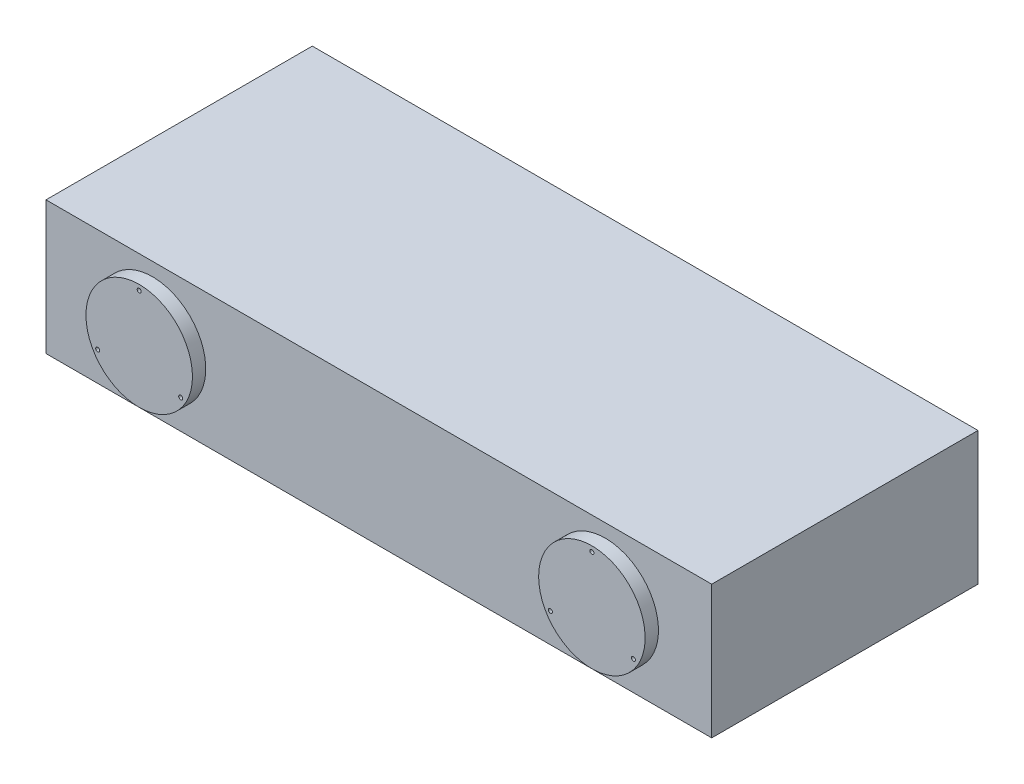
ISO-10303-21;
HEADER;
FILE_DESCRIPTION(('STEP AP214'),'2;1');
FILE_NAME('part.step','',(''),(''),'','','');
FILE_SCHEMA(('AUTOMOTIVE_DESIGN { 1 0 10303 214 1 1 1 1 }'));
ENDSEC;
DATA;
#1=APPLICATION_CONTEXT('core data for automotive mechanical design processes');
#2=APPLICATION_PROTOCOL_DEFINITION('international standard','automotive_design',2000,#1);
#3=PRODUCT_CONTEXT('',#1,'mechanical');
#4=PRODUCT('Part','Part','',(#3));
#5=PRODUCT_RELATED_PRODUCT_CATEGORY('part','',(#4));
#6=PRODUCT_DEFINITION_FORMATION('','',#4);
#7=PRODUCT_DEFINITION_CONTEXT('part definition',#1,'design');
#8=PRODUCT_DEFINITION('design','',#6,#7);
#9=PRODUCT_DEFINITION_SHAPE('','',#8);
#10=(LENGTH_UNIT() NAMED_UNIT(*) SI_UNIT(.MILLI.,.METRE.));
#11=(NAMED_UNIT(*) PLANE_ANGLE_UNIT() SI_UNIT($,.RADIAN.));
#12=(NAMED_UNIT(*) SI_UNIT($,.STERADIAN.) SOLID_ANGLE_UNIT());
#13=UNCERTAINTY_MEASURE_WITH_UNIT(LENGTH_MEASURE(1.E-05),#10,'distance_accuracy_value','');
#14=(GEOMETRIC_REPRESENTATION_CONTEXT(3) GLOBAL_UNCERTAINTY_ASSIGNED_CONTEXT((#13)) GLOBAL_UNIT_ASSIGNED_CONTEXT((#10,
#11,#12)) REPRESENTATION_CONTEXT('',''));
#15=CARTESIAN_POINT('',(0.,0.,0.));
#16=DIRECTION('',(0.,0.,1.));
#17=DIRECTION('',(1.,0.,0.));
#18=AXIS2_PLACEMENT_3D('',#15,#16,#17);
#19=CARTESIAN_POINT('',(-250.,100.,100.));
#20=DIRECTION('',(1.,0.,0.));
#21=DIRECTION('',(0.,0.,-1.));
#22=AXIS2_PLACEMENT_3D('',#19,#20,#21);
#23=PLANE('',#22);
#24=DIRECTION('',(0.,0.,1.));
#25=VECTOR('',#24,1.);
#26=CARTESIAN_POINT('',(-250.,0.,100.));
#27=LINE('',#26,#25);
#28=CARTESIAN_POINT('',(-250.,0.,-100.));
#29=VERTEX_POINT('',#28);
#30=CARTESIAN_POINT('',(-250.,0.,100.));
#31=VERTEX_POINT('',#30);
#32=EDGE_CURVE('E104',#29,#31,#27,.T.);
#33=ORIENTED_EDGE('',*,*,#32,.T.);
#34=DIRECTION('',(0.,-1.,0.));
#35=VECTOR('',#34,1.);
#36=CARTESIAN_POINT('',(-250.,100.,100.));
#37=LINE('',#36,#35);
#38=CARTESIAN_POINT('',(-250.,100.,100.));
#39=VERTEX_POINT('',#38);
#40=EDGE_CURVE('E95',#39,#31,#37,.T.);
#41=ORIENTED_EDGE('',*,*,#40,.F.);
#42=DIRECTION('',(0.,0.,1.));
#43=VECTOR('',#42,1.);
#44=CARTESIAN_POINT('',(-250.,100.,100.));
#45=LINE('',#44,#43);
#46=CARTESIAN_POINT('',(-250.,100.,-100.));
#47=VERTEX_POINT('',#46);
#48=EDGE_CURVE('E89',#47,#39,#45,.T.);
#49=ORIENTED_EDGE('',*,*,#48,.F.);
#50=DIRECTION('',(0.,-1.,0.));
#51=VECTOR('',#50,1.);
#52=CARTESIAN_POINT('',(-250.,100.,-100.));
#53=LINE('',#52,#51);
#54=EDGE_CURVE('E100',#47,#29,#53,.T.);
#55=ORIENTED_EDGE('',*,*,#54,.T.);
#56=EDGE_LOOP('',(#33,#41,#49,#55));
#57=FACE_BOUND('',#56,.T.);
#58=ADVANCED_FACE('F37',(#57),#23,.F.);
#59=CARTESIAN_POINT('',(250.,100.,100.));
#60=DIRECTION('',(0.,0.,-1.));
#61=DIRECTION('',(-1.,0.,0.));
#62=AXIS2_PLACEMENT_3D('',#59,#60,#61);
#63=PLANE('',#62);
#64=CARTESIAN_POINT('',(170.,50.,100.));
#65=DIRECTION('',(0.,0.,-1.));
#66=DIRECTION('',(-1.,0.,0.));
#67=AXIS2_PLACEMENT_3D('',#64,#65,#66);
#68=CIRCLE('',#67,40.);
#69=CARTESIAN_POINT('',(130.,50.,100.));
#70=VERTEX_POINT('',#69);
#71=EDGE_CURVE('E329',#70,#70,#68,.T.);
#72=ORIENTED_EDGE('',*,*,#71,.T.);
#73=EDGE_LOOP('',(#72));
#74=FACE_BOUND('',#73,.T.);
#75=CARTESIAN_POINT('',(-170.,50.,100.));
#76=DIRECTION('',(0.,0.,-1.));
#77=DIRECTION('',(-1.,0.,0.));
#78=AXIS2_PLACEMENT_3D('',#75,#76,#77);
#79=CIRCLE('',#78,40.);
#80=CARTESIAN_POINT('',(-210.,50.,100.));
#81=VERTEX_POINT('',#80);
#82=EDGE_CURVE('E45',#81,#81,#79,.F.);
#83=ORIENTED_EDGE('',*,*,#82,.F.);
#84=EDGE_LOOP('',(#83));
#85=FACE_BOUND('',#84,.T.);
#86=DIRECTION('',(1.,0.,0.));
#87=VECTOR('',#86,1.);
#88=CARTESIAN_POINT('',(250.,0.,100.));
#89=LINE('',#88,#87);
#90=CARTESIAN_POINT('',(250.,0.,100.));
#91=VERTEX_POINT('',#90);
#92=EDGE_CURVE('E94',#31,#91,#89,.T.);
#93=ORIENTED_EDGE('',*,*,#92,.T.);
#94=DIRECTION('',(0.,-1.,0.));
#95=VECTOR('',#94,1.);
#96=CARTESIAN_POINT('',(250.,100.,100.));
#97=LINE('',#96,#95);
#98=CARTESIAN_POINT('',(250.,100.,100.));
#99=VERTEX_POINT('',#98);
#100=EDGE_CURVE('E92',#99,#91,#97,.T.);
#101=ORIENTED_EDGE('',*,*,#100,.F.);
#102=DIRECTION('',(1.,0.,0.));
#103=VECTOR('',#102,1.);
#104=CARTESIAN_POINT('',(250.,100.,100.));
#105=LINE('',#104,#103);
#106=EDGE_CURVE('E84',#39,#99,#105,.T.);
#107=ORIENTED_EDGE('',*,*,#106,.F.);
#108=ORIENTED_EDGE('',*,*,#40,.T.);
#109=EDGE_LOOP('',(#93,#101,#107,#108));
#110=FACE_BOUND('',#109,.T.);
#111=ADVANCED_FACE('F93',(#74,#85,#110),#63,.F.);
#112=CARTESIAN_POINT('',(250.,100.,100.));
#113=DIRECTION('',(-1.,0.,0.));
#114=DIRECTION('',(0.,0.,1.));
#115=AXIS2_PLACEMENT_3D('',#112,#113,#114);
#116=PLANE('',#115);
#117=DIRECTION('',(0.,0.,-1.));
#118=VECTOR('',#117,1.);
#119=CARTESIAN_POINT('',(250.,0.,100.));
#120=LINE('',#119,#118);
#121=CARTESIAN_POINT('',(250.,0.,-100.));
#122=VERTEX_POINT('',#121);
#123=EDGE_CURVE('E70',#91,#122,#120,.T.);
#124=ORIENTED_EDGE('',*,*,#123,.T.);
#125=DIRECTION('',(0.,-1.,0.));
#126=VECTOR('',#125,1.);
#127=CARTESIAN_POINT('',(250.,100.,-100.));
#128=LINE('',#127,#126);
#129=CARTESIAN_POINT('',(250.,100.,-100.));
#130=VERTEX_POINT('',#129);
#131=EDGE_CURVE('E96',#130,#122,#128,.T.);
#132=ORIENTED_EDGE('',*,*,#131,.F.);
#133=DIRECTION('',(0.,0.,-1.));
#134=VECTOR('',#133,1.);
#135=CARTESIAN_POINT('',(250.,100.,100.));
#136=LINE('',#135,#134);
#137=EDGE_CURVE('E87',#99,#130,#136,.T.);
#138=ORIENTED_EDGE('',*,*,#137,.F.);
#139=ORIENTED_EDGE('',*,*,#100,.T.);
#140=EDGE_LOOP('',(#124,#132,#138,#139));
#141=FACE_BOUND('',#140,.T.);
#142=ADVANCED_FACE('F98',(#141),#116,.F.);
#143=CARTESIAN_POINT('',(250.,100.,-100.));
#144=DIRECTION('',(0.,0.,1.));
#145=DIRECTION('',(1.,0.,0.));
#146=AXIS2_PLACEMENT_3D('',#143,#144,#145);
#147=PLANE('',#146);
#148=CARTESIAN_POINT('',(170.,50.,-100.));
#149=DIRECTION('',(0.,0.,1.));
#150=DIRECTION('',(1.,0.,0.));
#151=AXIS2_PLACEMENT_3D('',#148,#149,#150);
#152=CIRCLE('',#151,40.);
#153=CARTESIAN_POINT('',(210.,50.,-100.));
#154=VERTEX_POINT('',#153);
#155=EDGE_CURVE('E11',#154,#154,#152,.F.);
#156=ORIENTED_EDGE('',*,*,#155,.F.);
#157=EDGE_LOOP('',(#156));
#158=FACE_BOUND('',#157,.T.);
#159=CARTESIAN_POINT('',(-170.,50.,-100.));
#160=DIRECTION('',(0.,0.,1.));
#161=DIRECTION('',(1.,0.,0.));
#162=AXIS2_PLACEMENT_3D('',#159,#160,#161);
#163=CIRCLE('',#162,40.);
#164=CARTESIAN_POINT('',(-130.,50.,-100.));
#165=VERTEX_POINT('',#164);
#166=EDGE_CURVE('E305',#165,#165,#163,.T.);
#167=ORIENTED_EDGE('',*,*,#166,.T.);
#168=EDGE_LOOP('',(#167));
#169=FACE_BOUND('',#168,.T.);
#170=DIRECTION('',(-1.,0.,0.));
#171=VECTOR('',#170,1.);
#172=CARTESIAN_POINT('',(250.,0.,-100.));
#173=LINE('',#172,#171);
#174=EDGE_CURVE('E76',#122,#29,#173,.T.);
#175=ORIENTED_EDGE('',*,*,#174,.T.);
#176=ORIENTED_EDGE('',*,*,#54,.F.);
#177=DIRECTION('',(-1.,0.,0.));
#178=VECTOR('',#177,1.);
#179=CARTESIAN_POINT('',(250.,100.,-100.));
#180=LINE('',#179,#178);
#181=EDGE_CURVE('E53',#130,#47,#180,.T.);
#182=ORIENTED_EDGE('',*,*,#181,.F.);
#183=ORIENTED_EDGE('',*,*,#131,.T.);
#184=EDGE_LOOP('',(#175,#176,#182,#183));
#185=FACE_BOUND('',#184,.T.);
#186=ADVANCED_FACE('F124',(#158,#169,#185),#147,.F.);
#187=CARTESIAN_POINT('',(0.,100.,0.));
#188=DIRECTION('',(0.,1.,0.));
#189=DIRECTION('',(0.,0.,1.));
#190=AXIS2_PLACEMENT_3D('',#187,#188,#189);
#191=PLANE('',#190);
#192=ORIENTED_EDGE('',*,*,#48,.T.);
#193=ORIENTED_EDGE('',*,*,#106,.T.);
#194=ORIENTED_EDGE('',*,*,#137,.T.);
#195=ORIENTED_EDGE('',*,*,#181,.T.);
#196=EDGE_LOOP('',(#192,#193,#194,#195));
#197=FACE_BOUND('',#196,.T.);
#198=ADVANCED_FACE('F85',(#197),#191,.T.);
#199=CARTESIAN_POINT('',(0.,0.,0.));
#200=DIRECTION('',(0.,1.,0.));
#201=DIRECTION('',(0.,0.,1.));
#202=AXIS2_PLACEMENT_3D('',#199,#200,#201);
#203=PLANE('',#202);
#204=ORIENTED_EDGE('',*,*,#32,.F.);
#205=ORIENTED_EDGE('',*,*,#174,.F.);
#206=ORIENTED_EDGE('',*,*,#123,.F.);
#207=ORIENTED_EDGE('',*,*,#92,.F.);
#208=EDGE_LOOP('',(#204,#205,#206,#207));
#209=FACE_BOUND('',#208,.T.);
#210=ADVANCED_FACE('F132',(#209),#203,.F.);
#211=CARTESIAN_POINT('',(-170.,50.,110.));
#212=DIRECTION('',(0.,0.,-1.));
#213=DIRECTION('',(-1.,0.,0.));
#214=AXIS2_PLACEMENT_3D('',#211,#212,#213);
#215=CYLINDRICAL_SURFACE('',#214,40.);
#216=CARTESIAN_POINT('',(-170.,50.,110.));
#217=DIRECTION('',(0.,0.,1.));
#218=DIRECTION('',(1.,0.,0.));
#219=AXIS2_PLACEMENT_3D('',#216,#217,#218);
#220=CIRCLE('',#219,40.);
#221=CARTESIAN_POINT('',(-130.,50.,110.));
#222=VERTEX_POINT('',#221);
#223=EDGE_CURVE('E107',#222,#222,#220,.T.);
#224=ORIENTED_EDGE('',*,*,#223,.F.);
#225=EDGE_LOOP('',(#224));
#226=FACE_BOUND('',#225,.T.);
#227=ORIENTED_EDGE('',*,*,#82,.T.);
#228=EDGE_LOOP('',(#227));
#229=FACE_BOUND('',#228,.T.);
#230=ADVANCED_FACE('F116',(#226,#229),#215,.T.);
#231=CARTESIAN_POINT('',(-170.,50.,110.));
#232=DIRECTION('',(0.,0.,1.));
#233=DIRECTION('',(1.,0.,0.));
#234=AXIS2_PLACEMENT_3D('',#231,#232,#233);
#235=PLANE('',#234);
#236=CARTESIAN_POINT('',(-201.17691453624,31.9999999999999,110.));
#237=DIRECTION('',(0.,0.,1.));
#238=DIRECTION('',(-0.500000000000004,0.866025403784436,0.));
#239=AXIS2_PLACEMENT_3D('',#236,#237,#238);
#240=CIRCLE('',#239,1.5);
#241=CARTESIAN_POINT('',(-201.92691453624,33.2990381056765,110.));
#242=VERTEX_POINT('',#241);
#243=EDGE_CURVE('E341',#242,#242,#240,.T.);
#244=ORIENTED_EDGE('',*,*,#243,.F.);
#245=EDGE_LOOP('',(#244));
#246=FACE_BOUND('',#245,.T.);
#247=CARTESIAN_POINT('',(-138.82308546376,32.0000000000003,110.));
#248=DIRECTION('',(0.,0.,1.));
#249=DIRECTION('',(-0.499999999999992,-0.866025403784443,0.));
#250=AXIS2_PLACEMENT_3D('',#247,#248,#249);
#251=CIRCLE('',#250,1.5);
#252=CARTESIAN_POINT('',(-139.57308546376,30.7009618943236,110.));
#253=VERTEX_POINT('',#252);
#254=EDGE_CURVE('E335',#253,#253,#251,.T.);
#255=ORIENTED_EDGE('',*,*,#254,.F.);
#256=EDGE_LOOP('',(#255));
#257=FACE_BOUND('',#256,.T.);
#258=CARTESIAN_POINT('',(-170.,86.,110.));
#259=DIRECTION('',(0.,0.,1.));
#260=DIRECTION('',(1.,0.,0.));
#261=AXIS2_PLACEMENT_3D('',#258,#259,#260);
#262=CIRCLE('',#261,1.5);
#263=CARTESIAN_POINT('',(-168.5,86.,110.));
#264=VERTEX_POINT('',#263);
#265=EDGE_CURVE('E340',#264,#264,#262,.T.);
#266=ORIENTED_EDGE('',*,*,#265,.F.);
#267=EDGE_LOOP('',(#266));
#268=FACE_BOUND('',#267,.T.);
#269=ORIENTED_EDGE('',*,*,#223,.T.);
#270=EDGE_LOOP('',(#269));
#271=FACE_BOUND('',#270,.T.);
#272=ADVANCED_FACE('F140',(#246,#257,#268,#271),#235,.T.);
#273=CARTESIAN_POINT('',(-170.,86.,90.));
#274=DIRECTION('',(0.,0.,1.));
#275=DIRECTION('',(1.,0.,0.));
#276=AXIS2_PLACEMENT_3D('',#273,#274,#275);
#277=CYLINDRICAL_SURFACE('',#276,1.5);
#278=CARTESIAN_POINT('',(-170.,86.,90.));
#279=DIRECTION('',(0.,0.,1.));
#280=DIRECTION('',(1.,0.,0.));
#281=AXIS2_PLACEMENT_3D('',#278,#279,#280);
#282=CIRCLE('',#281,1.5);
#283=CARTESIAN_POINT('',(-168.5,86.,90.));
#284=VERTEX_POINT('',#283);
#285=EDGE_CURVE('E349',#284,#284,#282,.T.);
#286=ORIENTED_EDGE('',*,*,#285,.F.);
#287=EDGE_LOOP('',(#286));
#288=FACE_BOUND('',#287,.T.);
#289=ORIENTED_EDGE('',*,*,#265,.T.);
#290=EDGE_LOOP('',(#289));
#291=FACE_BOUND('',#290,.T.);
#292=ADVANCED_FACE('F144',(#288,#291),#277,.F.);
#293=CARTESIAN_POINT('',(-170.,86.,90.));
#294=DIRECTION('',(0.,0.,1.));
#295=DIRECTION('',(1.,0.,0.));
#296=AXIS2_PLACEMENT_3D('',#293,#294,#295);
#297=PLANE('',#296);
#298=ORIENTED_EDGE('',*,*,#285,.T.);
#299=EDGE_LOOP('',(#298));
#300=FACE_BOUND('',#299,.T.);
#301=ADVANCED_FACE('F148',(#300),#297,.T.);
#302=CARTESIAN_POINT('',(-138.82308546376,32.0000000000003,90.));
#303=DIRECTION('',(0.,0.,1.));
#304=DIRECTION('',(1.,0.,0.));
#305=AXIS2_PLACEMENT_3D('',#302,#303,#304);
#306=CYLINDRICAL_SURFACE('',#305,1.5);
#307=CARTESIAN_POINT('',(-138.82308546376,32.0000000000003,90.));
#308=DIRECTION('',(0.,0.,1.));
#309=DIRECTION('',(-0.499999999999992,-0.866025403784443,0.));
#310=AXIS2_PLACEMENT_3D('',#307,#308,#309);
#311=CIRCLE('',#310,1.5);
#312=CARTESIAN_POINT('',(-139.57308546376,30.7009618943236,90.));
#313=VERTEX_POINT('',#312);
#314=EDGE_CURVE('E344',#313,#313,#311,.T.);
#315=ORIENTED_EDGE('',*,*,#314,.F.);
#316=EDGE_LOOP('',(#315));
#317=FACE_BOUND('',#316,.T.);
#318=ORIENTED_EDGE('',*,*,#254,.T.);
#319=EDGE_LOOP('',(#318));
#320=FACE_BOUND('',#319,.T.);
#321=ADVANCED_FACE('F152',(#317,#320),#306,.F.);
#322=CARTESIAN_POINT('',(-138.82308546376,32.0000000000003,90.));
#323=DIRECTION('',(0.,0.,1.));
#324=DIRECTION('',(-0.499999999999992,-0.866025403784443,0.));
#325=AXIS2_PLACEMENT_3D('',#322,#323,#324);
#326=PLANE('',#325);
#327=ORIENTED_EDGE('',*,*,#314,.T.);
#328=EDGE_LOOP('',(#327));
#329=FACE_BOUND('',#328,.T.);
#330=ADVANCED_FACE('F156',(#329),#326,.T.);
#331=CARTESIAN_POINT('',(-201.17691453624,31.9999999999999,90.));
#332=DIRECTION('',(0.,0.,1.));
#333=DIRECTION('',(1.,0.,0.));
#334=AXIS2_PLACEMENT_3D('',#331,#332,#333);
#335=CYLINDRICAL_SURFACE('',#334,1.5);
#336=CARTESIAN_POINT('',(-201.17691453624,31.9999999999999,90.));
#337=DIRECTION('',(0.,0.,1.));
#338=DIRECTION('',(-0.500000000000004,0.866025403784436,0.));
#339=AXIS2_PLACEMENT_3D('',#336,#337,#338);
#340=CIRCLE('',#339,1.5);
#341=CARTESIAN_POINT('',(-201.92691453624,33.2990381056765,90.));
#342=VERTEX_POINT('',#341);
#343=EDGE_CURVE('E337',#342,#342,#340,.T.);
#344=ORIENTED_EDGE('',*,*,#343,.F.);
#345=EDGE_LOOP('',(#344));
#346=FACE_BOUND('',#345,.T.);
#347=ORIENTED_EDGE('',*,*,#243,.T.);
#348=EDGE_LOOP('',(#347));
#349=FACE_BOUND('',#348,.T.);
#350=ADVANCED_FACE('F160',(#346,#349),#335,.F.);
#351=CARTESIAN_POINT('',(-201.17691453624,31.9999999999999,90.));
#352=DIRECTION('',(0.,0.,1.));
#353=DIRECTION('',(-0.500000000000004,0.866025403784436,0.));
#354=AXIS2_PLACEMENT_3D('',#351,#352,#353);
#355=PLANE('',#354);
#356=ORIENTED_EDGE('',*,*,#343,.T.);
#357=EDGE_LOOP('',(#356));
#358=FACE_BOUND('',#357,.T.);
#359=ADVANCED_FACE('F164',(#358),#355,.T.);
#360=CARTESIAN_POINT('',(170.,50.,110.));
#361=DIRECTION('',(0.,0.,-1.));
#362=DIRECTION('',(-1.,0.,0.));
#363=AXIS2_PLACEMENT_3D('',#360,#361,#362);
#364=CYLINDRICAL_SURFACE('',#363,40.);
#365=CARTESIAN_POINT('',(170.,50.,110.));
#366=DIRECTION('',(0.,0.,-1.));
#367=DIRECTION('',(-1.,0.,0.));
#368=AXIS2_PLACEMENT_3D('',#365,#366,#367);
#369=CIRCLE('',#368,40.);
#370=CARTESIAN_POINT('',(130.,50.,110.));
#371=VERTEX_POINT('',#370);
#372=EDGE_CURVE('E332',#371,#371,#369,.T.);
#373=ORIENTED_EDGE('',*,*,#372,.T.);
#374=EDGE_LOOP('',(#373));
#375=FACE_BOUND('',#374,.T.);
#376=ORIENTED_EDGE('',*,*,#71,.F.);
#377=EDGE_LOOP('',(#376));
#378=FACE_BOUND('',#377,.T.);
#379=ADVANCED_FACE('F168',(#375,#378),#364,.T.);
#380=CARTESIAN_POINT('',(170.,50.,110.));
#381=DIRECTION('',(0.,0.,1.));
#382=DIRECTION('',(-1.,0.,0.));
#383=AXIS2_PLACEMENT_3D('',#380,#381,#382);
#384=PLANE('',#383);
#385=CARTESIAN_POINT('',(201.17691453624,31.9999999999999,110.));
#386=DIRECTION('',(0.,0.,-1.));
#387=DIRECTION('',(0.500000000000004,0.866025403784436,0.));
#388=AXIS2_PLACEMENT_3D('',#385,#386,#387);
#389=CIRCLE('',#388,1.5);
#390=CARTESIAN_POINT('',(201.92691453624,33.2990381056765,110.));
#391=VERTEX_POINT('',#390);
#392=EDGE_CURVE('E318',#391,#391,#389,.T.);
#393=ORIENTED_EDGE('',*,*,#392,.T.);
#394=EDGE_LOOP('',(#393));
#395=FACE_BOUND('',#394,.T.);
#396=CARTESIAN_POINT('',(138.82308546376,32.0000000000003,110.));
#397=DIRECTION('',(0.,0.,-1.));
#398=DIRECTION('',(0.499999999999992,-0.866025403784443,0.));
#399=AXIS2_PLACEMENT_3D('',#396,#397,#398);
#400=CIRCLE('',#399,1.5);
#401=CARTESIAN_POINT('',(139.57308546376,30.7009618943236,110.));
#402=VERTEX_POINT('',#401);
#403=EDGE_CURVE('E311',#402,#402,#400,.T.);
#404=ORIENTED_EDGE('',*,*,#403,.T.);
#405=EDGE_LOOP('',(#404));
#406=FACE_BOUND('',#405,.T.);
#407=CARTESIAN_POINT('',(170.,86.,110.));
#408=DIRECTION('',(0.,0.,-1.));
#409=DIRECTION('',(-1.,0.,0.));
#410=AXIS2_PLACEMENT_3D('',#407,#408,#409);
#411=CIRCLE('',#410,1.5);
#412=CARTESIAN_POINT('',(168.5,86.,110.));
#413=VERTEX_POINT('',#412);
#414=EDGE_CURVE('E317',#413,#413,#411,.T.);
#415=ORIENTED_EDGE('',*,*,#414,.T.);
#416=EDGE_LOOP('',(#415));
#417=FACE_BOUND('',#416,.T.);
#418=ORIENTED_EDGE('',*,*,#372,.F.);
#419=EDGE_LOOP('',(#418));
#420=FACE_BOUND('',#419,.T.);
#421=ADVANCED_FACE('F172',(#395,#406,#417,#420),#384,.T.);
#422=CARTESIAN_POINT('',(170.,86.,90.));
#423=DIRECTION('',(0.,0.,1.));
#424=DIRECTION('',(1.,0.,0.));
#425=AXIS2_PLACEMENT_3D('',#422,#423,#424);
#426=CYLINDRICAL_SURFACE('',#425,1.5);
#427=CARTESIAN_POINT('',(170.,86.,90.));
#428=DIRECTION('',(0.,0.,-1.));
#429=DIRECTION('',(-1.,0.,0.));
#430=AXIS2_PLACEMENT_3D('',#427,#428,#429);
#431=CIRCLE('',#430,1.5);
#432=CARTESIAN_POINT('',(168.5,86.,90.));
#433=VERTEX_POINT('',#432);
#434=EDGE_CURVE('E326',#433,#433,#431,.T.);
#435=ORIENTED_EDGE('',*,*,#434,.T.);
#436=EDGE_LOOP('',(#435));
#437=FACE_BOUND('',#436,.T.);
#438=ORIENTED_EDGE('',*,*,#414,.F.);
#439=EDGE_LOOP('',(#438));
#440=FACE_BOUND('',#439,.T.);
#441=ADVANCED_FACE('F176',(#437,#440),#426,.F.);
#442=CARTESIAN_POINT('',(170.,86.,90.));
#443=DIRECTION('',(0.,0.,1.));
#444=DIRECTION('',(-1.,0.,0.));
#445=AXIS2_PLACEMENT_3D('',#442,#443,#444);
#446=PLANE('',#445);
#447=ORIENTED_EDGE('',*,*,#434,.F.);
#448=EDGE_LOOP('',(#447));
#449=FACE_BOUND('',#448,.T.);
#450=ADVANCED_FACE('F180',(#449),#446,.T.);
#451=CARTESIAN_POINT('',(138.82308546376,32.0000000000003,90.));
#452=DIRECTION('',(0.,0.,1.));
#453=DIRECTION('',(1.,0.,0.));
#454=AXIS2_PLACEMENT_3D('',#451,#452,#453);
#455=CYLINDRICAL_SURFACE('',#454,1.5);
#456=CARTESIAN_POINT('',(138.82308546376,32.0000000000003,90.));
#457=DIRECTION('',(0.,0.,-1.));
#458=DIRECTION('',(0.499999999999992,-0.866025403784443,0.));
#459=AXIS2_PLACEMENT_3D('',#456,#457,#458);
#460=CIRCLE('',#459,1.5);
#461=CARTESIAN_POINT('',(139.57308546376,30.7009618943236,90.));
#462=VERTEX_POINT('',#461);
#463=EDGE_CURVE('E321',#462,#462,#460,.T.);
#464=ORIENTED_EDGE('',*,*,#463,.T.);
#465=EDGE_LOOP('',(#464));
#466=FACE_BOUND('',#465,.T.);
#467=ORIENTED_EDGE('',*,*,#403,.F.);
#468=EDGE_LOOP('',(#467));
#469=FACE_BOUND('',#468,.T.);
#470=ADVANCED_FACE('F184',(#466,#469),#455,.F.);
#471=CARTESIAN_POINT('',(138.82308546376,32.0000000000003,90.));
#472=DIRECTION('',(0.,0.,1.));
#473=DIRECTION('',(0.499999999999992,-0.866025403784443,0.));
#474=AXIS2_PLACEMENT_3D('',#471,#472,#473);
#475=PLANE('',#474);
#476=ORIENTED_EDGE('',*,*,#463,.F.);
#477=EDGE_LOOP('',(#476));
#478=FACE_BOUND('',#477,.T.);
#479=ADVANCED_FACE('F188',(#478),#475,.T.);
#480=CARTESIAN_POINT('',(201.17691453624,31.9999999999999,90.));
#481=DIRECTION('',(0.,0.,1.));
#482=DIRECTION('',(1.,0.,0.));
#483=AXIS2_PLACEMENT_3D('',#480,#481,#482);
#484=CYLINDRICAL_SURFACE('',#483,1.5);
#485=CARTESIAN_POINT('',(201.17691453624,31.9999999999999,90.));
#486=DIRECTION('',(0.,0.,-1.));
#487=DIRECTION('',(0.500000000000004,0.866025403784436,0.));
#488=AXIS2_PLACEMENT_3D('',#485,#486,#487);
#489=CIRCLE('',#488,1.5);
#490=CARTESIAN_POINT('',(201.92691453624,33.2990381056765,90.));
#491=VERTEX_POINT('',#490);
#492=EDGE_CURVE('E314',#491,#491,#489,.T.);
#493=ORIENTED_EDGE('',*,*,#492,.T.);
#494=EDGE_LOOP('',(#493));
#495=FACE_BOUND('',#494,.T.);
#496=ORIENTED_EDGE('',*,*,#392,.F.);
#497=EDGE_LOOP('',(#496));
#498=FACE_BOUND('',#497,.T.);
#499=ADVANCED_FACE('F192',(#495,#498),#484,.F.);
#500=CARTESIAN_POINT('',(201.17691453624,31.9999999999999,90.));
#501=DIRECTION('',(0.,0.,1.));
#502=DIRECTION('',(0.500000000000004,0.866025403784436,0.));
#503=AXIS2_PLACEMENT_3D('',#500,#501,#502);
#504=PLANE('',#503);
#505=ORIENTED_EDGE('',*,*,#492,.F.);
#506=EDGE_LOOP('',(#505));
#507=FACE_BOUND('',#506,.T.);
#508=ADVANCED_FACE('F196',(#507),#504,.T.);
#509=CARTESIAN_POINT('',(-170.,50.,-110.));
#510=DIRECTION('',(0.,0.,1.));
#511=DIRECTION('',(1.,0.,0.));
#512=AXIS2_PLACEMENT_3D('',#509,#510,#511);
#513=CYLINDRICAL_SURFACE('',#512,40.);
#514=CARTESIAN_POINT('',(-170.,50.,-110.));
#515=DIRECTION('',(0.,0.,1.));
#516=DIRECTION('',(1.,0.,0.));
#517=AXIS2_PLACEMENT_3D('',#514,#515,#516);
#518=CIRCLE('',#517,40.);
#519=CARTESIAN_POINT('',(-130.,50.,-110.));
#520=VERTEX_POINT('',#519);
#521=EDGE_CURVE('E308',#520,#520,#518,.T.);
#522=ORIENTED_EDGE('',*,*,#521,.T.);
#523=EDGE_LOOP('',(#522));
#524=FACE_BOUND('',#523,.T.);
#525=ORIENTED_EDGE('',*,*,#166,.F.);
#526=EDGE_LOOP('',(#525));
#527=FACE_BOUND('',#526,.T.);
#528=ADVANCED_FACE('F200',(#524,#527),#513,.T.);
#529=CARTESIAN_POINT('',(-170.,50.,-110.));
#530=DIRECTION('',(0.,0.,-1.));
#531=DIRECTION('',(1.,0.,0.));
#532=AXIS2_PLACEMENT_3D('',#529,#530,#531);
#533=PLANE('',#532);
#534=CARTESIAN_POINT('',(-201.17691453624,31.9999999999999,-110.));
#535=DIRECTION('',(0.,0.,1.));
#536=DIRECTION('',(-0.500000000000004,0.866025403784436,0.));
#537=AXIS2_PLACEMENT_3D('',#534,#535,#536);
#538=CIRCLE('',#537,1.5);
#539=CARTESIAN_POINT('',(-201.92691453624,33.2990381056765,-110.));
#540=VERTEX_POINT('',#539);
#541=EDGE_CURVE('E294',#540,#540,#538,.T.);
#542=ORIENTED_EDGE('',*,*,#541,.T.);
#543=EDGE_LOOP('',(#542));
#544=FACE_BOUND('',#543,.T.);
#545=CARTESIAN_POINT('',(-138.82308546376,32.0000000000003,-110.));
#546=DIRECTION('',(0.,0.,1.));
#547=DIRECTION('',(-0.499999999999992,-0.866025403784443,0.));
#548=AXIS2_PLACEMENT_3D('',#545,#546,#547);
#549=CIRCLE('',#548,1.5);
#550=CARTESIAN_POINT('',(-139.57308546376,30.7009618943236,-110.));
#551=VERTEX_POINT('',#550);
#552=EDGE_CURVE('E289',#551,#551,#549,.T.);
#553=ORIENTED_EDGE('',*,*,#552,.T.);
#554=EDGE_LOOP('',(#553));
#555=FACE_BOUND('',#554,.T.);
#556=CARTESIAN_POINT('',(-170.,86.,-110.));
#557=DIRECTION('',(0.,0.,1.));
#558=DIRECTION('',(1.,0.,0.));
#559=AXIS2_PLACEMENT_3D('',#556,#557,#558);
#560=CIRCLE('',#559,1.5);
#561=CARTESIAN_POINT('',(-168.5,86.,-110.));
#562=VERTEX_POINT('',#561);
#563=EDGE_CURVE('E293',#562,#562,#560,.T.);
#564=ORIENTED_EDGE('',*,*,#563,.T.);
#565=EDGE_LOOP('',(#564));
#566=FACE_BOUND('',#565,.T.);
#567=ORIENTED_EDGE('',*,*,#521,.F.);
#568=EDGE_LOOP('',(#567));
#569=FACE_BOUND('',#568,.T.);
#570=ADVANCED_FACE('F204',(#544,#555,#566,#569),#533,.T.);
#571=CARTESIAN_POINT('',(-170.,86.,-90.));
#572=DIRECTION('',(0.,0.,-1.));
#573=DIRECTION('',(-1.,0.,0.));
#574=AXIS2_PLACEMENT_3D('',#571,#572,#573);
#575=CYLINDRICAL_SURFACE('',#574,1.5);
#576=CARTESIAN_POINT('',(-170.,86.,-90.));
#577=DIRECTION('',(0.,0.,1.));
#578=DIRECTION('',(1.,0.,0.));
#579=AXIS2_PLACEMENT_3D('',#576,#577,#578);
#580=CIRCLE('',#579,1.5);
#581=CARTESIAN_POINT('',(-168.5,86.,-90.));
#582=VERTEX_POINT('',#581);
#583=EDGE_CURVE('E302',#582,#582,#580,.T.);
#584=ORIENTED_EDGE('',*,*,#583,.T.);
#585=EDGE_LOOP('',(#584));
#586=FACE_BOUND('',#585,.T.);
#587=ORIENTED_EDGE('',*,*,#563,.F.);
#588=EDGE_LOOP('',(#587));
#589=FACE_BOUND('',#588,.T.);
#590=ADVANCED_FACE('F208',(#586,#589),#575,.F.);
#591=CARTESIAN_POINT('',(-170.,86.,-90.));
#592=DIRECTION('',(0.,0.,-1.));
#593=DIRECTION('',(1.,0.,0.));
#594=AXIS2_PLACEMENT_3D('',#591,#592,#593);
#595=PLANE('',#594);
#596=ORIENTED_EDGE('',*,*,#583,.F.);
#597=EDGE_LOOP('',(#596));
#598=FACE_BOUND('',#597,.T.);
#599=ADVANCED_FACE('F212',(#598),#595,.T.);
#600=CARTESIAN_POINT('',(-138.82308546376,32.0000000000003,-90.));
#601=DIRECTION('',(0.,0.,-1.));
#602=DIRECTION('',(-1.,0.,0.));
#603=AXIS2_PLACEMENT_3D('',#600,#601,#602);
#604=CYLINDRICAL_SURFACE('',#603,1.5);
#605=CARTESIAN_POINT('',(-138.82308546376,32.0000000000003,-90.));
#606=DIRECTION('',(0.,0.,1.));
#607=DIRECTION('',(-0.499999999999992,-0.866025403784443,0.));
#608=AXIS2_PLACEMENT_3D('',#605,#606,#607);
#609=CIRCLE('',#608,1.5);
#610=CARTESIAN_POINT('',(-139.57308546376,30.7009618943236,-90.));
#611=VERTEX_POINT('',#610);
#612=EDGE_CURVE('E297',#611,#611,#609,.T.);
#613=ORIENTED_EDGE('',*,*,#612,.T.);
#614=EDGE_LOOP('',(#613));
#615=FACE_BOUND('',#614,.T.);
#616=ORIENTED_EDGE('',*,*,#552,.F.);
#617=EDGE_LOOP('',(#616));
#618=FACE_BOUND('',#617,.T.);
#619=ADVANCED_FACE('F216',(#615,#618),#604,.F.);
#620=CARTESIAN_POINT('',(-138.82308546376,32.0000000000003,-90.));
#621=DIRECTION('',(0.,0.,-1.));
#622=DIRECTION('',(-0.499999999999992,-0.866025403784443,0.));
#623=AXIS2_PLACEMENT_3D('',#620,#621,#622);
#624=PLANE('',#623);
#625=ORIENTED_EDGE('',*,*,#612,.F.);
#626=EDGE_LOOP('',(#625));
#627=FACE_BOUND('',#626,.T.);
#628=ADVANCED_FACE('F220',(#627),#624,.T.);
#629=CARTESIAN_POINT('',(-201.17691453624,31.9999999999999,-90.));
#630=DIRECTION('',(0.,0.,-1.));
#631=DIRECTION('',(-1.,0.,0.));
#632=AXIS2_PLACEMENT_3D('',#629,#630,#631);
#633=CYLINDRICAL_SURFACE('',#632,1.5);
#634=CARTESIAN_POINT('',(-201.17691453624,31.9999999999999,-90.));
#635=DIRECTION('',(0.,0.,1.));
#636=DIRECTION('',(-0.500000000000004,0.866025403784436,0.));
#637=AXIS2_PLACEMENT_3D('',#634,#635,#636);
#638=CIRCLE('',#637,1.5);
#639=CARTESIAN_POINT('',(-201.92691453624,33.2990381056765,-90.));
#640=VERTEX_POINT('',#639);
#641=EDGE_CURVE('E290',#640,#640,#638,.T.);
#642=ORIENTED_EDGE('',*,*,#641,.T.);
#643=EDGE_LOOP('',(#642));
#644=FACE_BOUND('',#643,.T.);
#645=ORIENTED_EDGE('',*,*,#541,.F.);
#646=EDGE_LOOP('',(#645));
#647=FACE_BOUND('',#646,.T.);
#648=ADVANCED_FACE('F224',(#644,#647),#633,.F.);
#649=CARTESIAN_POINT('',(-201.17691453624,31.9999999999999,-90.));
#650=DIRECTION('',(0.,0.,-1.));
#651=DIRECTION('',(-0.500000000000004,0.866025403784436,0.));
#652=AXIS2_PLACEMENT_3D('',#649,#650,#651);
#653=PLANE('',#652);
#654=ORIENTED_EDGE('',*,*,#641,.F.);
#655=EDGE_LOOP('',(#654));
#656=FACE_BOUND('',#655,.T.);
#657=ADVANCED_FACE('F228',(#656),#653,.T.);
#658=CARTESIAN_POINT('',(170.,50.,-110.));
#659=DIRECTION('',(0.,0.,1.));
#660=DIRECTION('',(1.,0.,0.));
#661=AXIS2_PLACEMENT_3D('',#658,#659,#660);
#662=CYLINDRICAL_SURFACE('',#661,40.);
#663=CARTESIAN_POINT('',(170.,50.,-110.));
#664=DIRECTION('',(0.,0.,-1.));
#665=DIRECTION('',(-1.,0.,0.));
#666=AXIS2_PLACEMENT_3D('',#663,#664,#665);
#667=CIRCLE('',#666,40.);
#668=CARTESIAN_POINT('',(130.,50.,-110.));
#669=VERTEX_POINT('',#668);
#670=EDGE_CURVE('E285',#669,#669,#667,.T.);
#671=ORIENTED_EDGE('',*,*,#670,.F.);
#672=EDGE_LOOP('',(#671));
#673=FACE_BOUND('',#672,.T.);
#674=ORIENTED_EDGE('',*,*,#155,.T.);
#675=EDGE_LOOP('',(#674));
#676=FACE_BOUND('',#675,.T.);
#677=ADVANCED_FACE('F232',(#673,#676),#662,.T.);
#678=CARTESIAN_POINT('',(170.,50.,-110.));
#679=DIRECTION('',(0.,0.,-1.));
#680=DIRECTION('',(-1.,0.,0.));
#681=AXIS2_PLACEMENT_3D('',#678,#679,#680);
#682=PLANE('',#681);
#683=CARTESIAN_POINT('',(201.17691453624,31.9999999999999,-110.));
#684=DIRECTION('',(0.,0.,-1.));
#685=DIRECTION('',(0.500000000000004,0.866025403784436,0.));
#686=AXIS2_PLACEMENT_3D('',#683,#684,#685);
#687=CIRCLE('',#686,1.5);
#688=CARTESIAN_POINT('',(201.92691453624,33.2990381056765,-110.));
#689=VERTEX_POINT('',#688);
#690=EDGE_CURVE('E270',#689,#689,#687,.T.);
#691=ORIENTED_EDGE('',*,*,#690,.F.);
#692=EDGE_LOOP('',(#691));
#693=FACE_BOUND('',#692,.T.);
#694=CARTESIAN_POINT('',(138.82308546376,32.0000000000003,-110.));
#695=DIRECTION('',(0.,0.,-1.));
#696=DIRECTION('',(0.499999999999992,-0.866025403784443,0.));
#697=AXIS2_PLACEMENT_3D('',#694,#695,#696);
#698=CIRCLE('',#697,1.5);
#699=CARTESIAN_POINT('',(139.57308546376,30.7009618943236,-110.));
#700=VERTEX_POINT('',#699);
#701=EDGE_CURVE('E281',#700,#700,#698,.T.);
#702=ORIENTED_EDGE('',*,*,#701,.F.);
#703=EDGE_LOOP('',(#702));
#704=FACE_BOUND('',#703,.T.);
#705=CARTESIAN_POINT('',(170.,86.,-110.));
#706=DIRECTION('',(0.,0.,-1.));
#707=DIRECTION('',(-1.,0.,0.));
#708=AXIS2_PLACEMENT_3D('',#705,#706,#707);
#709=CIRCLE('',#708,1.5);
#710=CARTESIAN_POINT('',(168.5,86.,-110.));
#711=VERTEX_POINT('',#710);
#712=EDGE_CURVE('E269',#711,#711,#709,.T.);
#713=ORIENTED_EDGE('',*,*,#712,.F.);
#714=EDGE_LOOP('',(#713));
#715=FACE_BOUND('',#714,.T.);
#716=ORIENTED_EDGE('',*,*,#670,.T.);
#717=EDGE_LOOP('',(#716));
#718=FACE_BOUND('',#717,.T.);
#719=ADVANCED_FACE('F236',(#693,#704,#715,#718),#682,.T.);
#720=CARTESIAN_POINT('',(170.,86.,-90.));
#721=DIRECTION('',(0.,0.,-1.));
#722=DIRECTION('',(-1.,0.,0.));
#723=AXIS2_PLACEMENT_3D('',#720,#721,#722);
#724=CYLINDRICAL_SURFACE('',#723,1.5);
#725=CARTESIAN_POINT('',(170.,86.,-90.));
#726=DIRECTION('',(0.,0.,-1.));
#727=DIRECTION('',(-1.,0.,0.));
#728=AXIS2_PLACEMENT_3D('',#725,#726,#727);
#729=CIRCLE('',#728,1.5);
#730=CARTESIAN_POINT('',(168.5,86.,-90.));
#731=VERTEX_POINT('',#730);
#732=EDGE_CURVE('E273',#731,#731,#729,.T.);
#733=ORIENTED_EDGE('',*,*,#732,.F.);
#734=EDGE_LOOP('',(#733));
#735=FACE_BOUND('',#734,.T.);
#736=ORIENTED_EDGE('',*,*,#712,.T.);
#737=EDGE_LOOP('',(#736));
#738=FACE_BOUND('',#737,.T.);
#739=ADVANCED_FACE('F240',(#735,#738),#724,.F.);
#740=CARTESIAN_POINT('',(170.,86.,-90.));
#741=DIRECTION('',(0.,0.,-1.));
#742=DIRECTION('',(-1.,0.,0.));
#743=AXIS2_PLACEMENT_3D('',#740,#741,#742);
#744=PLANE('',#743);
#745=ORIENTED_EDGE('',*,*,#732,.T.);
#746=EDGE_LOOP('',(#745));
#747=FACE_BOUND('',#746,.T.);
#748=ADVANCED_FACE('F244',(#747),#744,.T.);
#749=CARTESIAN_POINT('',(138.82308546376,32.0000000000003,-90.));
#750=DIRECTION('',(0.,0.,-1.));
#751=DIRECTION('',(-1.,0.,0.));
#752=AXIS2_PLACEMENT_3D('',#749,#750,#751);
#753=CYLINDRICAL_SURFACE('',#752,1.5);
#754=CARTESIAN_POINT('',(138.82308546376,32.0000000000003,-90.));
#755=DIRECTION('',(0.,0.,-1.));
#756=DIRECTION('',(0.499999999999992,-0.866025403784443,0.));
#757=AXIS2_PLACEMENT_3D('',#754,#755,#756);
#758=CIRCLE('',#757,1.5);
#759=CARTESIAN_POINT('',(139.57308546376,30.7009618943236,-90.));
#760=VERTEX_POINT('',#759);
#761=EDGE_CURVE('E276',#760,#760,#758,.T.);
#762=ORIENTED_EDGE('',*,*,#761,.F.);
#763=EDGE_LOOP('',(#762));
#764=FACE_BOUND('',#763,.T.);
#765=ORIENTED_EDGE('',*,*,#701,.T.);
#766=EDGE_LOOP('',(#765));
#767=FACE_BOUND('',#766,.T.);
#768=ADVANCED_FACE('F248',(#764,#767),#753,.F.);
#769=CARTESIAN_POINT('',(138.82308546376,32.0000000000003,-90.));
#770=DIRECTION('',(0.,0.,-1.));
#771=DIRECTION('',(0.499999999999992,-0.866025403784443,0.));
#772=AXIS2_PLACEMENT_3D('',#769,#770,#771);
#773=PLANE('',#772);
#774=ORIENTED_EDGE('',*,*,#761,.T.);
#775=EDGE_LOOP('',(#774));
#776=FACE_BOUND('',#775,.T.);
#777=ADVANCED_FACE('F252',(#776),#773,.T.);
#778=CARTESIAN_POINT('',(201.17691453624,31.9999999999999,-90.));
#779=DIRECTION('',(0.,0.,-1.));
#780=DIRECTION('',(-1.,0.,0.));
#781=AXIS2_PLACEMENT_3D('',#778,#779,#780);
#782=CYLINDRICAL_SURFACE('',#781,1.5);
#783=CARTESIAN_POINT('',(201.17691453624,31.9999999999999,-90.));
#784=DIRECTION('',(0.,0.,-1.));
#785=DIRECTION('',(0.500000000000004,0.866025403784436,0.));
#786=AXIS2_PLACEMENT_3D('',#783,#784,#785);
#787=CIRCLE('',#786,1.5);
#788=CARTESIAN_POINT('',(201.92691453624,33.2990381056765,-90.));
#789=VERTEX_POINT('',#788);
#790=EDGE_CURVE('E268',#789,#789,#787,.T.);
#791=ORIENTED_EDGE('',*,*,#790,.F.);
#792=EDGE_LOOP('',(#791));
#793=FACE_BOUND('',#792,.T.);
#794=ORIENTED_EDGE('',*,*,#690,.T.);
#795=EDGE_LOOP('',(#794));
#796=FACE_BOUND('',#795,.T.);
#797=ADVANCED_FACE('F256',(#793,#796),#782,.F.);
#798=CARTESIAN_POINT('',(201.17691453624,31.9999999999999,-90.));
#799=DIRECTION('',(0.,0.,-1.));
#800=DIRECTION('',(0.500000000000004,0.866025403784436,0.));
#801=AXIS2_PLACEMENT_3D('',#798,#799,#800);
#802=PLANE('',#801);
#803=ORIENTED_EDGE('',*,*,#790,.T.);
#804=EDGE_LOOP('',(#803));
#805=FACE_BOUND('',#804,.T.);
#806=ADVANCED_FACE('F260',(#805),#802,.T.);
#807=CLOSED_SHELL('',(#58,#111,#142,#186,#198,#210,#230,#272,#292,#301,#321,#330,#350,#359,#379,
#421,#441,#450,#470,#479,#499,#508,#528,#570,#590,#599,#619,#628,#648,#657,#677,#719,#739,#748,
#768,#777,#797,#806));
#808=MANIFOLD_SOLID_BREP('B2',#807);
#809=ADVANCED_BREP_SHAPE_REPRESENTATION('',(#18,#808),#14);
#810=SHAPE_DEFINITION_REPRESENTATION(#9,#809);
ENDSEC;
END-ISO-10303-21;
